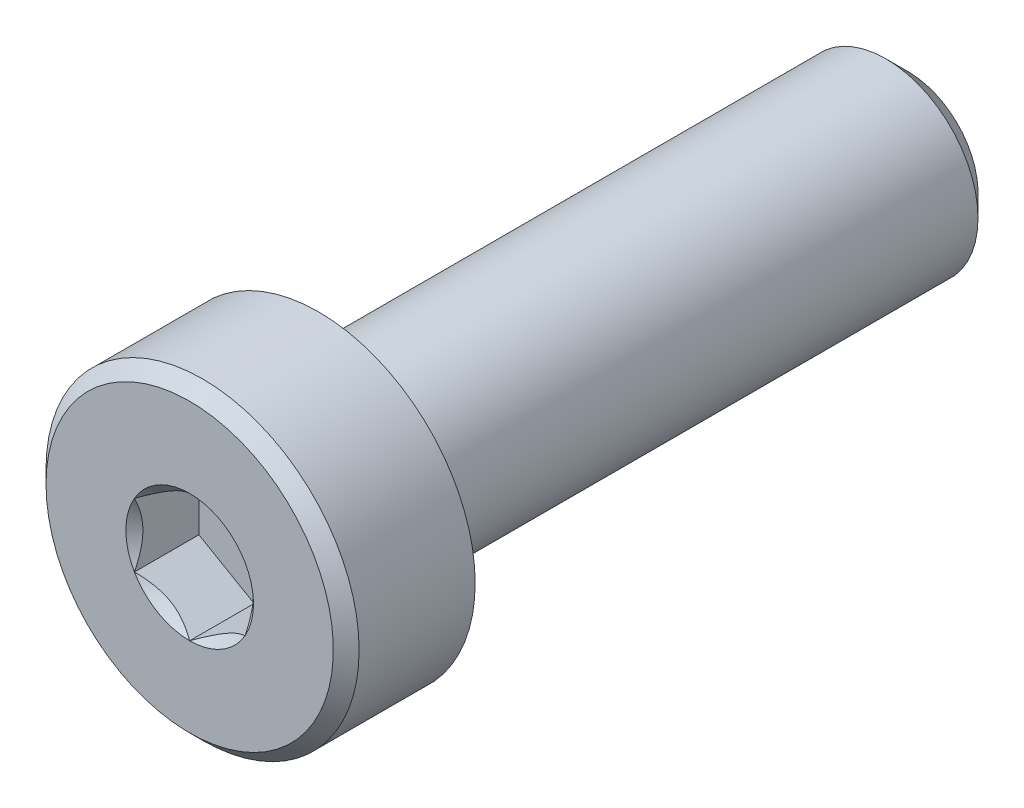
ISO-10303-21;
HEADER;
FILE_DESCRIPTION(('STEP AP214'),'2;1');
FILE_NAME('part.step','',(''),(''),'','','');
FILE_SCHEMA(('AUTOMOTIVE_DESIGN { 1 0 10303 214 1 1 1 1 }'));
ENDSEC;
DATA;
#1=APPLICATION_CONTEXT('core data for automotive mechanical design processes');
#2=APPLICATION_PROTOCOL_DEFINITION('international standard','automotive_design',2000,#1);
#3=PRODUCT_CONTEXT('',#1,'mechanical');
#4=PRODUCT('Part','Part','',(#3));
#5=PRODUCT_RELATED_PRODUCT_CATEGORY('part','',(#4));
#6=PRODUCT_DEFINITION_FORMATION('','',#4);
#7=PRODUCT_DEFINITION_CONTEXT('part definition',#1,'design');
#8=PRODUCT_DEFINITION('design','',#6,#7);
#9=PRODUCT_DEFINITION_SHAPE('','',#8);
#10=(LENGTH_UNIT() NAMED_UNIT(*) SI_UNIT(.MILLI.,.METRE.));
#11=(NAMED_UNIT(*) PLANE_ANGLE_UNIT() SI_UNIT($,.RADIAN.));
#12=(NAMED_UNIT(*) SI_UNIT($,.STERADIAN.) SOLID_ANGLE_UNIT());
#13=UNCERTAINTY_MEASURE_WITH_UNIT(LENGTH_MEASURE(1.E-05),#10,'distance_accuracy_value','');
#14=(GEOMETRIC_REPRESENTATION_CONTEXT(3) GLOBAL_UNCERTAINTY_ASSIGNED_CONTEXT((#13)) GLOBAL_UNIT_ASSIGNED_CONTEXT((#10,
#11,#12)) REPRESENTATION_CONTEXT('',''));
#15=CARTESIAN_POINT('',(0.,0.,0.));
#16=DIRECTION('',(0.,0.,1.));
#17=DIRECTION('',(1.,0.,0.));
#18=AXIS2_PLACEMENT_3D('',#15,#16,#17);
#19=CARTESIAN_POINT('',(0.,0.,9.75));
#20=DIRECTION('',(0.,0.,1.));
#21=DIRECTION('',(1.,0.,0.));
#22=AXIS2_PLACEMENT_3D('',#19,#20,#21);
#23=PLANE('',#22);
#24=CARTESIAN_POINT('',(0.,0.,9.75));
#25=DIRECTION('',(0.,0.,1.));
#26=DIRECTION('',(1.,0.,0.));
#27=AXIS2_PLACEMENT_3D('',#24,#25,#26);
#28=CIRCLE('',#27,1.73205080756888);
#29=CARTESIAN_POINT('',(1.5,0.866025403784443,9.75));
#30=VERTEX_POINT('',#29);
#31=CARTESIAN_POINT('',(0.,1.73205080756888,9.75));
#32=VERTEX_POINT('',#31);
#33=EDGE_CURVE('E177',#30,#32,#28,.T.);
#34=ORIENTED_EDGE('',*,*,#33,.F.);
#35=CARTESIAN_POINT('',(1.5,-0.866025403784439,9.75));
#36=VERTEX_POINT('',#35);
#37=EDGE_CURVE('E185',#36,#30,#28,.T.);
#38=ORIENTED_EDGE('',*,*,#37,.F.);
#39=CARTESIAN_POINT('',(0.,-1.73205080756888,9.75));
#40=VERTEX_POINT('',#39);
#41=EDGE_CURVE('E191',#40,#36,#28,.T.);
#42=ORIENTED_EDGE('',*,*,#41,.F.);
#43=CARTESIAN_POINT('',(-1.5,-0.866025403784441,9.75));
#44=VERTEX_POINT('',#43);
#45=EDGE_CURVE('E53',#44,#40,#28,.T.);
#46=ORIENTED_EDGE('',*,*,#45,.F.);
#47=CARTESIAN_POINT('',(-1.5,0.86602540378444,9.75));
#48=VERTEX_POINT('',#47);
#49=EDGE_CURVE('E61',#48,#44,#28,.T.);
#50=ORIENTED_EDGE('',*,*,#49,.F.);
#51=EDGE_CURVE('E182',#32,#48,#28,.T.);
#52=ORIENTED_EDGE('',*,*,#51,.F.);
#53=EDGE_LOOP('',(#34,#38,#42,#46,#50,#52));
#54=FACE_BOUND('',#53,.T.);
#55=CARTESIAN_POINT('',(0.,0.,9.75));
#56=DIRECTION('',(0.,0.,-1.));
#57=DIRECTION('',(-1.,0.,0.));
#58=AXIS2_PLACEMENT_3D('',#55,#56,#57);
#59=CIRCLE('',#58,3.9);
#60=CARTESIAN_POINT('',(-3.9,0.,9.75));
#61=VERTEX_POINT('',#60);
#62=EDGE_CURVE('E48',#61,#61,#59,.T.);
#63=ORIENTED_EDGE('',*,*,#62,.F.);
#64=EDGE_LOOP('',(#63));
#65=FACE_BOUND('',#64,.T.);
#66=ADVANCED_FACE('F34',(#54,#65),#23,.T.);
#67=CARTESIAN_POINT('',(0.,0.,9.4));
#68=DIRECTION('',(0.,0.,-1.));
#69=DIRECTION('',(-1.,0.,0.));
#70=AXIS2_PLACEMENT_3D('',#67,#68,#69);
#71=CONICAL_SURFACE('',#70,4.25,0.785398163397451);
#72=ORIENTED_EDGE('',*,*,#62,.T.);
#73=EDGE_LOOP('',(#72));
#74=FACE_BOUND('',#73,.T.);
#75=CARTESIAN_POINT('',(0.,0.,9.4));
#76=DIRECTION('',(0.,0.,-1.));
#77=DIRECTION('',(-1.,0.,0.));
#78=AXIS2_PLACEMENT_3D('',#75,#76,#77);
#79=CIRCLE('',#78,4.25);
#80=CARTESIAN_POINT('',(-4.25,0.,9.4));
#81=VERTEX_POINT('',#80);
#82=EDGE_CURVE('E160',#81,#81,#79,.T.);
#83=ORIENTED_EDGE('',*,*,#82,.F.);
#84=EDGE_LOOP('',(#83));
#85=FACE_BOUND('',#84,.T.);
#86=ADVANCED_FACE('F164',(#74,#85),#71,.T.);
#87=CARTESIAN_POINT('',(0.,0.,-9.75));
#88=DIRECTION('',(0.,0.,-1.));
#89=DIRECTION('',(-1.,0.,0.));
#90=AXIS2_PLACEMENT_3D('',#87,#88,#89);
#91=CYLINDRICAL_SURFACE('',#90,4.25);
#92=ORIENTED_EDGE('',*,*,#82,.T.);
#93=EDGE_LOOP('',(#92));
#94=FACE_BOUND('',#93,.T.);
#95=CARTESIAN_POINT('',(0.,0.,6.25));
#96=DIRECTION('',(0.,0.,-1.));
#97=DIRECTION('',(-1.,0.,0.));
#98=AXIS2_PLACEMENT_3D('',#95,#96,#97);
#99=CIRCLE('',#98,4.25);
#100=CARTESIAN_POINT('',(-4.25,0.,6.25));
#101=VERTEX_POINT('',#100);
#102=EDGE_CURVE('E157',#101,#101,#99,.T.);
#103=ORIENTED_EDGE('',*,*,#102,.F.);
#104=EDGE_LOOP('',(#103));
#105=FACE_BOUND('',#104,.T.);
#106=ADVANCED_FACE('F174',(#94,#105),#91,.T.);
#107=CARTESIAN_POINT('',(0.,4.25,6.25));
#108=DIRECTION('',(0.,0.,-1.));
#109=DIRECTION('',(-1.,0.,0.));
#110=AXIS2_PLACEMENT_3D('',#107,#108,#109);
#111=PLANE('',#110);
#112=ORIENTED_EDGE('',*,*,#102,.T.);
#113=EDGE_LOOP('',(#112));
#114=FACE_BOUND('',#113,.T.);
#115=CARTESIAN_POINT('',(0.,0.,6.25));
#116=DIRECTION('',(0.,0.,-1.));
#117=DIRECTION('',(-1.,0.,0.));
#118=AXIS2_PLACEMENT_3D('',#115,#116,#117);
#119=CIRCLE('',#118,2.5);
#120=CARTESIAN_POINT('',(-2.5,0.,6.25));
#121=VERTEX_POINT('',#120);
#122=EDGE_CURVE('E151',#121,#121,#119,.T.);
#123=ORIENTED_EDGE('',*,*,#122,.F.);
#124=EDGE_LOOP('',(#123));
#125=FACE_BOUND('',#124,.T.);
#126=ADVANCED_FACE('F264',(#114,#125),#111,.T.);
#127=CARTESIAN_POINT('',(0.,0.,-9.75));
#128=DIRECTION('',(0.,0.,-1.));
#129=DIRECTION('',(-1.,0.,0.));
#130=AXIS2_PLACEMENT_3D('',#127,#128,#129);
#131=CYLINDRICAL_SURFACE('',#130,2.5);
#132=ORIENTED_EDGE('',*,*,#122,.T.);
#133=EDGE_LOOP('',(#132));
#134=FACE_BOUND('',#133,.T.);
#135=CARTESIAN_POINT('',(0.,0.,-9.15));
#136=DIRECTION('',(0.,0.,-1.));
#137=DIRECTION('',(-1.,0.,0.));
#138=AXIS2_PLACEMENT_3D('',#135,#136,#137);
#139=CIRCLE('',#138,2.5);
#140=CARTESIAN_POINT('',(-2.5,0.,-9.15));
#141=VERTEX_POINT('',#140);
#142=EDGE_CURVE('E152',#141,#141,#139,.T.);
#143=ORIENTED_EDGE('',*,*,#142,.F.);
#144=EDGE_LOOP('',(#143));
#145=FACE_BOUND('',#144,.T.);
#146=ADVANCED_FACE('F260',(#134,#145),#131,.T.);
#147=CARTESIAN_POINT('',(0.,0.,-9.75));
#148=DIRECTION('',(0.,0.,1.));
#149=DIRECTION('',(1.,0.,0.));
#150=AXIS2_PLACEMENT_3D('',#147,#148,#149);
#151=CONICAL_SURFACE('',#150,1.9,0.785398163397446);
#152=ORIENTED_EDGE('',*,*,#142,.T.);
#153=EDGE_LOOP('',(#152));
#154=FACE_BOUND('',#153,.T.);
#155=CARTESIAN_POINT('',(0.,0.,-9.75));
#156=DIRECTION('',(0.,0.,-1.));
#157=DIRECTION('',(-1.,0.,0.));
#158=AXIS2_PLACEMENT_3D('',#155,#156,#157);
#159=CIRCLE('',#158,1.9);
#160=CARTESIAN_POINT('',(-1.9,0.,-9.75));
#161=VERTEX_POINT('',#160);
#162=EDGE_CURVE('E140',#161,#161,#159,.T.);
#163=ORIENTED_EDGE('',*,*,#162,.F.);
#164=EDGE_LOOP('',(#163));
#165=FACE_BOUND('',#164,.T.);
#166=ADVANCED_FACE('F254',(#154,#165),#151,.T.);
#167=CARTESIAN_POINT('',(0.,1.90000000000001,-9.75));
#168=DIRECTION('',(0.,0.,-1.));
#169=DIRECTION('',(-1.,0.,0.));
#170=AXIS2_PLACEMENT_3D('',#167,#168,#169);
#171=PLANE('',#170);
#172=ORIENTED_EDGE('',*,*,#162,.T.);
#173=EDGE_LOOP('',(#172));
#174=FACE_BOUND('',#173,.T.);
#175=ADVANCED_FACE('F249',(#174),#171,.T.);
#176=CARTESIAN_POINT('',(0.,0.,9.75));
#177=DIRECTION('',(0.,0.,1.));
#178=DIRECTION('',(1.,0.,0.));
#179=AXIS2_PLACEMENT_3D('',#176,#177,#178);
#180=CONICAL_SURFACE('',#179,1.73205080756888,0.78539816339745);
#181=ORIENTED_EDGE('',*,*,#37,.T.);
#182=CARTESIAN_POINT('',(1.5,-1.72720812994823,10.3055785164605));
#183=CARTESIAN_POINT('',(1.5,-1.68515175723693,10.2738299080399));
#184=CARTESIAN_POINT('',(1.5,-1.64286104772391,10.2423925939825));
#185=CARTESIAN_POINT('',(1.5,-1.55771581058238,10.180269087717));
#186=CARTESIAN_POINT('',(1.5,-1.5148611440825,10.1495830860455));
#187=CARTESIAN_POINT('',(1.5,-1.38468134170665,10.0584071925586));
#188=CARTESIAN_POINT('',(1.5,-1.29637976089562,9.99928834354366));
#189=CARTESIAN_POINT('',(1.5,-1.11121478745132,9.88323099640349));
#190=CARTESIAN_POINT('',(1.5,-1.01415038251068,9.82660955880473));
#191=CARTESIAN_POINT('',(1.5,-0.815173408989816,9.72303688130909));
#192=CARTESIAN_POINT('',(1.5,-0.713278669326361,9.67605304157207));
#193=CARTESIAN_POINT('',(1.5,-0.560333775001792,9.61857266845154));
#194=CARTESIAN_POINT('',(1.5,-0.511547983012751,9.60207538777834));
#195=CARTESIAN_POINT('',(1.5,-0.412798620213831,9.57299751294763));
#196=CARTESIAN_POINT('',(1.5,-0.362834968520753,9.5604171886138));
#197=CARTESIAN_POINT('',(1.5,-0.262863235540419,9.54003619416346));
#198=CARTESIAN_POINT('',(1.5,-0.212872113909477,9.53215363276045));
#199=CARTESIAN_POINT('',(1.5,-0.112355243682834,9.52132206397768));
#200=CARTESIAN_POINT('',(1.5,-0.0618295884917333,9.51837220852945));
#201=CARTESIAN_POINT('',(1.5,0.037429173202547,9.51762485772178));
#202=CARTESIAN_POINT('',(1.5,0.0861609670655318,9.51964473355048));
#203=CARTESIAN_POINT('',(1.5,0.183206937624693,9.52832255287941));
#204=CARTESIAN_POINT('',(1.5,0.231521073289698,9.53498094694588));
#205=CARTESIAN_POINT('',(1.5,0.328199853268105,9.55268524408904));
#206=CARTESIAN_POINT('',(1.5,0.376550616148689,9.56380581121775));
#207=CARTESIAN_POINT('',(1.5,0.472195696955758,9.58984341399777));
#208=CARTESIAN_POINT('',(1.5,0.519490102919007,9.6047601319841));
#209=CARTESIAN_POINT('',(1.5,0.668391282485061,9.65733522351148));
#210=CARTESIAN_POINT('',(1.5,0.767878709264948,9.70098128736183));
#211=CARTESIAN_POINT('',(1.5,0.962179866385497,9.79802299442906));
#212=CARTESIAN_POINT('',(1.5,1.05697519927965,9.85145366489712));
#213=CARTESIAN_POINT('',(1.5,1.23814273494588,9.96168585175783));
#214=CARTESIAN_POINT('',(1.5,1.32469942140117,10.0181879204262));
#215=CARTESIAN_POINT('',(1.5,1.45222331245984,10.1055343012678));
#216=CARTESIAN_POINT('',(1.5,1.49418091932911,10.1349577583565));
#217=CARTESIAN_POINT('',(1.5,1.57752272883329,10.1945828214816));
#218=CARTESIAN_POINT('',(1.5,1.61890708598059,10.2247842113029));
#219=CARTESIAN_POINT('',(1.5,1.66005277969054,10.2553081782352));
#220=B_SPLINE_CURVE_WITH_KNOTS('',3,(#182,#183,#184,#185,#186,#187,#188,#189,#190,#191,#192,
#193,#194,#195,#196,#197,#198,#199,#200,#201,#202,#203,#204,#205,#206,#207,#208,#209,#210,#211,
#212,#213,#214,#215,#216,#217,#218,#219),.UNSPECIFIED.,.F.,.F.,(4,2,2,2,2,2,2,2,2,2,2,2,2,2,2,2,
2,2,4),(0.,0.158079549012757,0.316198781054128,0.634850417468465,0.971690311551783,
1.30737131686505,1.46173961151184,1.61611853763032,1.76772101442095,1.91929742387554,
2.06538741227089,2.21149159321503,2.36014984648185,2.50879566399376,2.83376031423511,
3.15991186974582,3.4698560178094,3.62358896013691,3.77727962610764),.UNSPECIFIED.);
#221=EDGE_CURVE('E11',#36,#30,#220,.T.);
#222=ORIENTED_EDGE('',*,*,#221,.F.);
#223=EDGE_LOOP('',(#181,#222));
#224=FACE_BOUND('',#223,.T.);
#225=ADVANCED_FACE('F219',(#224),#180,.F.);
#226=ORIENTED_EDGE('',*,*,#33,.T.);
#227=CARTESIAN_POINT('',(1.5002,0.865909933730603,9.75011548160007));
#228=CARTESIAN_POINT('',(1.44863220926292,0.895682611594168,9.72036547606733));
#229=CARTESIAN_POINT('',(1.3962020823348,0.925953159489767,9.69236248391031));
#230=CARTESIAN_POINT('',(1.2892909659444,0.987678321317125,9.64108923044014));
#231=CARTESIAN_POINT('',(1.23479980418534,1.01913880822718,9.61784750504437));
#232=CARTESIAN_POINT('',(1.12492091864275,1.08257741237345,9.57803372899222));
#233=CARTESIAN_POINT('',(1.0695611909048,1.11453936608522,9.5613615856709));
#234=CARTESIAN_POINT('',(0.957622742522849,1.1791670593912,9.53567445681811));
#235=CARTESIAN_POINT('',(0.901047443446991,1.21183082354213,9.52664029047887));
#236=CARTESIAN_POINT('',(0.803544610483559,1.26812411040032,9.51848908122686));
#237=CARTESIAN_POINT('',(0.762743091719534,1.29168087824208,9.51728225298922));
#238=CARTESIAN_POINT('',(0.681212030384142,1.33875285845138,9.51931405716227));
#239=CARTESIAN_POINT('',(0.64048250568537,1.36226806050018,9.52255367074831));
#240=CARTESIAN_POINT('',(0.559415597836584,1.40907206156905,9.53329198598196));
#241=CARTESIAN_POINT('',(0.519078615401712,1.43236062923612,9.54079465301873));
#242=CARTESIAN_POINT('',(0.439081663085969,1.47854689118997,9.55965161192829));
#243=CARTESIAN_POINT('',(0.399421991483792,1.50144441326545,9.57100755701859));
#244=CARTESIAN_POINT('',(0.297836865225515,1.56009461325633,9.60472164759267));
#245=CARTESIAN_POINT('',(0.236541446290311,1.59548353987866,9.62962184909337));
#246=CARTESIAN_POINT('',(0.146414371536687,1.64751843074894,9.67165665327158));
#247=CARTESIAN_POINT('',(0.116714860092283,1.66466545167617,9.6864251535591));
#248=CARTESIAN_POINT('',(0.0578620986162501,1.69864410935691,9.71731056594017));
#249=CARTESIAN_POINT('',(0.0287085957793641,1.71547589206761,9.73342683412171));
#250=CARTESIAN_POINT('',(-0.000199999999998554,1.73216627762271,9.75011548160007));
#251=B_SPLINE_CURVE_WITH_KNOTS('',3,(#227,#228,#229,#230,#231,#232,#233,#234,#235,#236,#237,
#238,#239,#240,#241,#242,#243,#244,#245,#246,#247,#248,#249,#250),.UNSPECIFIED.,.F.,.F.,(4,2,2,
2,2,2,2,2,2,2,2,4),(0.,0.199829143693304,0.400822987382388,0.598623720538179,0.795926240188886,
0.937113067959878,1.07833105577192,1.21968061668222,1.36109089931054,1.58570969637565,
1.69770705470963,1.80965120737193),.UNSPECIFIED.);
#252=EDGE_CURVE('E187',#30,#32,#251,.T.);
#253=ORIENTED_EDGE('',*,*,#252,.F.);
#254=EDGE_LOOP('',(#226,#253));
#255=FACE_BOUND('',#254,.T.);
#256=ADVANCED_FACE('F315',(#255),#180,.F.);
#257=ORIENTED_EDGE('',*,*,#51,.T.);
#258=CARTESIAN_POINT('',(0.000200000000001173,1.73216627762272,9.75011548160008));
#259=CARTESIAN_POINT('',(-0.0513677907370745,1.70239359975915,9.72036547606733));
#260=CARTESIAN_POINT('',(-0.103797917665199,1.67212305186355,9.69236248391032));
#261=CARTESIAN_POINT('',(-0.210709034055595,1.61039789003619,9.64108923044014));
#262=CARTESIAN_POINT('',(-0.265200195814659,1.57893740312614,9.61784750504438));
#263=CARTESIAN_POINT('',(-0.375079081357247,1.51549879897987,9.57803372899222));
#264=CARTESIAN_POINT('',(-0.430438809095198,1.4835368452681,9.5613615856709));
#265=CARTESIAN_POINT('',(-0.542377257477149,1.41890915196211,9.53567445681811));
#266=CARTESIAN_POINT('',(-0.598952556553007,1.38624538781118,9.52664029047887));
#267=CARTESIAN_POINT('',(-0.696455389516439,1.329952100953,9.51848908122686));
#268=CARTESIAN_POINT('',(-0.737256908280465,1.30639533311124,9.51728225298922));
#269=CARTESIAN_POINT('',(-0.818787969615857,1.25932335290194,9.51931405716227));
#270=CARTESIAN_POINT('',(-0.859517494314628,1.23580815085313,9.52255367074831));
#271=CARTESIAN_POINT('',(-0.940584402163415,1.18900414978427,9.53329198598196));
#272=CARTESIAN_POINT('',(-0.980921384598287,1.1657155821172,9.54079465301874));
#273=CARTESIAN_POINT('',(-1.06091833691403,1.11952932016335,9.55965161192829));
#274=CARTESIAN_POINT('',(-1.10057800851621,1.09663179808786,9.57100755701859));
#275=CARTESIAN_POINT('',(-1.20216313477448,1.03798159809699,9.60472164759267));
#276=CARTESIAN_POINT('',(-1.26345855370969,1.00259267147465,9.62962184909337));
#277=CARTESIAN_POINT('',(-1.35358562846331,0.950557780604376,9.67165665327158));
#278=CARTESIAN_POINT('',(-1.38328513990772,0.933410759677149,9.6864251535591));
#279=CARTESIAN_POINT('',(-1.44213790138375,0.899432101996408,9.71731056594017));
#280=CARTESIAN_POINT('',(-1.47129140422064,0.882600319285711,9.73342683412171));
#281=CARTESIAN_POINT('',(-1.5002,0.865909933730602,9.75011548160008));
#282=B_SPLINE_CURVE_WITH_KNOTS('',3,(#258,#259,#260,#261,#262,#263,#264,#265,#266,#267,#268,
#269,#270,#271,#272,#273,#274,#275,#276,#277,#278,#279,#280,#281),.UNSPECIFIED.,.F.,.F.,(4,2,2,
2,2,2,2,2,2,2,2,4),(0.,0.199829143693304,0.400822987382388,0.598623720538181,0.795926240188889,
0.937113067959881,1.07833105577193,1.21968061668222,1.36109089931054,1.58570969637565,
1.69770705470964,1.80965120737194),.UNSPECIFIED.);
#283=EDGE_CURVE('E186',#32,#48,#282,.T.);
#284=ORIENTED_EDGE('',*,*,#283,.F.);
#285=EDGE_LOOP('',(#257,#284));
#286=FACE_BOUND('',#285,.T.);
#287=ADVANCED_FACE('F319',(#286),#180,.F.);
#288=ORIENTED_EDGE('',*,*,#49,.T.);
#289=CARTESIAN_POINT('',(-1.5,-1.72720812969692,10.3055785162708));
#290=CARTESIAN_POINT('',(-1.5,-1.68515175699268,10.2738299078574));
#291=CARTESIAN_POINT('',(-1.5,-1.64286104748673,10.2423925938074));
#292=CARTESIAN_POINT('',(-1.5,-1.55771581035942,10.1802690875564));
#293=CARTESIAN_POINT('',(-1.5,-1.51486114386668,10.1495830858922));
#294=CARTESIAN_POINT('',(-1.5,-1.3846813415127,10.0584071924272));
#295=CARTESIAN_POINT('',(-1.5,-1.29637976071653,9.99928834342677));
#296=CARTESIAN_POINT('',(-1.5,-1.11121478730467,9.8832309963165));
#297=CARTESIAN_POINT('',(-1.5,-1.01415038238167,9.82660955873301));
#298=CARTESIAN_POINT('',(-1.5,-0.815173408897604,9.72303688126565));
#299=CARTESIAN_POINT('',(-1.5,-0.713278669253284,9.67605304154167));
#300=CARTESIAN_POINT('',(-1.5,-0.560333774943111,9.61857266843083));
#301=CARTESIAN_POINT('',(-1.5,-0.511547982948041,9.60207538775725));
#302=CARTESIAN_POINT('',(-1.5,-0.412798620136866,9.572997512927));
#303=CARTESIAN_POINT('',(-1.5,-0.362834968437562,9.56041718859402));
#304=CARTESIAN_POINT('',(-1.5,-0.262863235444981,9.54003619414677));
#305=CARTESIAN_POINT('',(-1.5,-0.212872113808022,9.53215363274598));
#306=CARTESIAN_POINT('',(-1.5,-0.112355243569544,9.521322063969));
#307=CARTESIAN_POINT('',(-1.5,-0.0618295883726267,9.51837220852435));
#308=CARTESIAN_POINT('',(-1.5,0.0374291733323851,9.51762485772485));
#309=CARTESIAN_POINT('',(-1.5,0.0861609672002997,9.51964473355808));
#310=CARTESIAN_POINT('',(-1.5,0.183206937768827,9.52832255289676));
#311=CARTESIAN_POINT('',(-1.5,0.23152107343827,9.53498094696846));
#312=CARTESIAN_POINT('',(-1.5,0.328199853425436,9.55268524412257));
#313=CARTESIAN_POINT('',(-1.5,0.376550616310329,9.56380581125704));
#314=CARTESIAN_POINT('',(-1.5,0.472195697125599,9.58984341404871));
#315=CARTESIAN_POINT('',(-1.5,0.51949010309274,9.60476013204094));
#316=CARTESIAN_POINT('',(-1.5,0.668391282696625,9.65733522359607));
#317=CARTESIAN_POINT('',(-1.5,0.767878709508553,9.70098128747198));
#318=CARTESIAN_POINT('',(-1.5,0.962179866690724,9.7980229945931));
#319=CARTESIAN_POINT('',(-1.5,1.05697519961444,9.85145366508953));
#320=CARTESIAN_POINT('',(-1.5,1.23814273533383,9.96168585200456));
#321=CARTESIAN_POINT('',(-1.5,1.3246994218129,10.0181879206986));
#322=CARTESIAN_POINT('',(-1.5,1.45222331290673,10.1055343015787));
#323=CARTESIAN_POINT('',(-1.5,1.49418091978756,10.13495775868));
#324=CARTESIAN_POINT('',(-1.5,1.57752272931476,10.1945828218305));
#325=CARTESIAN_POINT('',(-1.5,1.61890708647354,10.2247842116644));
#326=CARTESIAN_POINT('',(-1.5,1.66005278019494,10.2553081786095));
#327=B_SPLINE_CURVE_WITH_KNOTS('',3,(#289,#290,#291,#292,#293,#294,#295,#296,#297,#298,#299,
#300,#301,#302,#303,#304,#305,#306,#307,#308,#309,#310,#311,#312,#313,#314,#315,#316,#317,#318,
#319,#320,#321,#322,#323,#324,#325,#326),.UNSPECIFIED.,.F.,.F.,(4,2,2,2,2,2,2,2,2,2,2,2,2,2,2,2,
2,2,4),(0.,0.158079548982669,0.316198780993942,0.634850417346959,0.971690311361511,
1.30737131660667,1.46173961127089,1.61611853740677,1.7677210142141,1.91929742368538,
2.065387412096,2.21149159305544,2.36014984633872,2.50879566386709,2.83376031422673,
3.15991186985652,3.46985601802197,3.62358896039974,3.7772796264207),.UNSPECIFIED.);
#328=EDGE_CURVE('E197',#48,#44,#327,.F.);
#329=ORIENTED_EDGE('',*,*,#328,.F.);
#330=EDGE_LOOP('',(#288,#329));
#331=FACE_BOUND('',#330,.T.);
#332=ADVANCED_FACE('F323',(#331),#180,.F.);
#333=ORIENTED_EDGE('',*,*,#45,.T.);
#334=CARTESIAN_POINT('',(-1.5002,-0.865909933730601,9.75011548160007));
#335=CARTESIAN_POINT('',(-1.44863220926292,-0.895682611594166,9.72036547606733));
#336=CARTESIAN_POINT('',(-1.3962020823348,-0.925953159489765,9.69236248391031));
#337=CARTESIAN_POINT('',(-1.2892909659444,-0.987678321317123,9.64108923044014));
#338=CARTESIAN_POINT('',(-1.23479980418534,-1.01913880822717,9.61784750504438));
#339=CARTESIAN_POINT('',(-1.12492091864275,-1.08257741237344,9.57803372899222));
#340=CARTESIAN_POINT('',(-1.0695611909048,-1.11453936608521,9.5613615856709));
#341=CARTESIAN_POINT('',(-0.957622742522849,-1.1791670593912,9.5356744568181));
#342=CARTESIAN_POINT('',(-0.901047443446991,-1.21183082354213,9.52664029047887));
#343=CARTESIAN_POINT('',(-0.803544610483559,-1.26812411040032,9.51848908122685));
#344=CARTESIAN_POINT('',(-0.762743091719534,-1.29168087824208,9.51728225298922));
#345=CARTESIAN_POINT('',(-0.681212030384142,-1.33875285845138,9.51931405716227));
#346=CARTESIAN_POINT('',(-0.64048250568537,-1.36226806050018,9.52255367074831));
#347=CARTESIAN_POINT('',(-0.559415597836584,-1.40907206156905,9.53329198598196));
#348=CARTESIAN_POINT('',(-0.519078615401712,-1.43236062923612,9.54079465301873));
#349=CARTESIAN_POINT('',(-0.439081663085969,-1.47854689118996,9.55965161192829));
#350=CARTESIAN_POINT('',(-0.399421991483792,-1.50144441326545,9.57100755701859));
#351=CARTESIAN_POINT('',(-0.297836865225515,-1.56009461325633,9.60472164759267));
#352=CARTESIAN_POINT('',(-0.236541446290311,-1.59548353987866,9.62962184909337));
#353=CARTESIAN_POINT('',(-0.146414371536686,-1.64751843074894,9.67165665327158));
#354=CARTESIAN_POINT('',(-0.116714860092282,-1.66466545167617,9.6864251535591));
#355=CARTESIAN_POINT('',(-0.0578620986162489,-1.69864410935691,9.71731056594017));
#356=CARTESIAN_POINT('',(-0.0287085957793629,-1.71547589206761,9.73342683412171));
#357=CARTESIAN_POINT('',(0.000199999999999649,-1.73216627762271,9.75011548160007));
#358=B_SPLINE_CURVE_WITH_KNOTS('',3,(#334,#335,#336,#337,#338,#339,#340,#341,#342,#343,#344,
#345,#346,#347,#348,#349,#350,#351,#352,#353,#354,#355,#356,#357),.UNSPECIFIED.,.F.,.F.,(4,2,2,
2,2,2,2,2,2,2,2,4),(0.,0.199829143693304,0.400822987382388,0.59862372053818,0.795926240188888,
0.93711306795988,1.07833105577193,1.21968061668222,1.36109089931054,1.58570969637565,
1.69770705470963,1.80965120737193),.UNSPECIFIED.);
#359=EDGE_CURVE('E119',#44,#40,#358,.T.);
#360=ORIENTED_EDGE('',*,*,#359,.F.);
#361=EDGE_LOOP('',(#333,#360));
#362=FACE_BOUND('',#361,.T.);
#363=ADVANCED_FACE('F220',(#362),#180,.F.);
#364=ORIENTED_EDGE('',*,*,#41,.T.);
#365=CARTESIAN_POINT('',(-0.000199999999999716,-1.73216627762271,9.75011548160007));
#366=CARTESIAN_POINT('',(0.0513677907370757,-1.70239359975915,9.72036547606733));
#367=CARTESIAN_POINT('',(0.103797917665201,-1.67212305186355,9.69236248391031));
#368=CARTESIAN_POINT('',(0.210709034055597,-1.61039789003619,9.64108923044014));
#369=CARTESIAN_POINT('',(0.265200195814661,-1.57893740312614,9.61784750504438));
#370=CARTESIAN_POINT('',(0.375079081357249,-1.51549879897987,9.57803372899222));
#371=CARTESIAN_POINT('',(0.4304388090952,-1.4835368452681,9.5613615856709));
#372=CARTESIAN_POINT('',(0.542377257477151,-1.41890915196211,9.53567445681811));
#373=CARTESIAN_POINT('',(0.598952556553009,-1.38624538781118,9.52664029047887));
#374=CARTESIAN_POINT('',(0.696455389516442,-1.32995210095299,9.51848908122686));
#375=CARTESIAN_POINT('',(0.737256908280467,-1.30639533311124,9.51728225298922));
#376=CARTESIAN_POINT('',(0.818787969615859,-1.25932335290193,9.51931405716227));
#377=CARTESIAN_POINT('',(0.859517494314631,-1.23580815085313,9.52255367074831));
#378=CARTESIAN_POINT('',(0.940584402163417,-1.18900414978427,9.53329198598196));
#379=CARTESIAN_POINT('',(0.980921384598289,-1.16571558211719,9.54079465301874));
#380=CARTESIAN_POINT('',(1.06091833691403,-1.11952932016335,9.55965161192829));
#381=CARTESIAN_POINT('',(1.10057800851621,-1.09663179808786,9.57100755701859));
#382=CARTESIAN_POINT('',(1.20216313477449,-1.03798159809698,9.60472164759267));
#383=CARTESIAN_POINT('',(1.26345855370969,-1.00259267147465,9.62962184909337));
#384=CARTESIAN_POINT('',(1.35358562846331,-0.950557780604374,9.67165665327158));
#385=CARTESIAN_POINT('',(1.38328513990772,-0.933410759677147,9.6864251535591));
#386=CARTESIAN_POINT('',(1.44213790138375,-0.899432101996407,9.71731056594017));
#387=CARTESIAN_POINT('',(1.47129140422064,-0.88260031928571,9.73342683412171));
#388=CARTESIAN_POINT('',(1.5002,-0.865909933730601,9.75011548160007));
#389=B_SPLINE_CURVE_WITH_KNOTS('',3,(#365,#366,#367,#368,#369,#370,#371,#372,#373,#374,#375,
#376,#377,#378,#379,#380,#381,#382,#383,#384,#385,#386,#387,#388),.UNSPECIFIED.,.F.,.F.,(4,2,2,
2,2,2,2,2,2,2,2,4),(0.,0.199829143693304,0.400822987382388,0.598623720538181,0.79592624018889,
0.937113067959881,1.07833105577193,1.21968061668222,1.36109089931054,1.58570969637565,
1.69770705470963,1.80965120737193),.UNSPECIFIED.);
#390=EDGE_CURVE('E103',#40,#36,#389,.T.);
#391=ORIENTED_EDGE('',*,*,#390,.F.);
#392=EDGE_LOOP('',(#364,#391));
#393=FACE_BOUND('',#392,.T.);
#394=ADVANCED_FACE('F194',(#393),#180,.F.);
#395=CARTESIAN_POINT('',(0.,0.,8.));
#396=DIRECTION('',(0.,0.,1.));
#397=DIRECTION('',(1.,0.,0.));
#398=AXIS2_PLACEMENT_3D('',#395,#396,#397);
#399=PLANE('',#398);
#400=DIRECTION('',(0.866025403784439,0.5,0.));
#401=VECTOR('',#400,1.);
#402=CARTESIAN_POINT('',(0.,-1.73205080756888,8.));
#403=LINE('',#402,#401);
#404=CARTESIAN_POINT('',(0.,-1.73205080756888,8.));
#405=VERTEX_POINT('',#404);
#406=CARTESIAN_POINT('',(1.5,-0.866025403784439,8.));
#407=VERTEX_POINT('',#406);
#408=EDGE_CURVE('E100',#405,#407,#403,.T.);
#409=ORIENTED_EDGE('',*,*,#408,.T.);
#410=DIRECTION('',(0.,1.,0.));
#411=VECTOR('',#410,1.);
#412=CARTESIAN_POINT('',(1.5,-0.866025403784439,8.));
#413=LINE('',#412,#411);
#414=CARTESIAN_POINT('',(1.5,0.866025403784441,8.));
#415=VERTEX_POINT('',#414);
#416=EDGE_CURVE('E108',#407,#415,#413,.T.);
#417=ORIENTED_EDGE('',*,*,#416,.T.);
#418=DIRECTION('',(-0.866025403784439,0.5,0.));
#419=VECTOR('',#418,1.);
#420=CARTESIAN_POINT('',(1.5,0.866025403784441,8.));
#421=LINE('',#420,#419);
#422=CARTESIAN_POINT('',(0.,1.73205080756888,8.));
#423=VERTEX_POINT('',#422);
#424=EDGE_CURVE('E112',#415,#423,#421,.T.);
#425=ORIENTED_EDGE('',*,*,#424,.T.);
#426=DIRECTION('',(-0.866025403784439,-0.499999999999999,0.));
#427=VECTOR('',#426,1.);
#428=CARTESIAN_POINT('',(0.,1.73205080756888,8.));
#429=LINE('',#428,#427);
#430=CARTESIAN_POINT('',(-1.5,0.86602540378444,8.));
#431=VERTEX_POINT('',#430);
#432=EDGE_CURVE('E129',#423,#431,#429,.T.);
#433=ORIENTED_EDGE('',*,*,#432,.T.);
#434=DIRECTION('',(0.,-1.,0.));
#435=VECTOR('',#434,1.);
#436=CARTESIAN_POINT('',(-1.5,0.86602540378444,8.));
#437=LINE('',#436,#435);
#438=CARTESIAN_POINT('',(-1.5,-0.866025403784439,8.));
#439=VERTEX_POINT('',#438);
#440=EDGE_CURVE('E135',#431,#439,#437,.T.);
#441=ORIENTED_EDGE('',*,*,#440,.T.);
#442=DIRECTION('',(0.866025403784438,-0.5,0.));
#443=VECTOR('',#442,1.);
#444=CARTESIAN_POINT('',(-1.5,-0.866025403784439,8.));
#445=LINE('',#444,#443);
#446=EDGE_CURVE('E102',#439,#405,#445,.T.);
#447=ORIENTED_EDGE('',*,*,#446,.T.);
#448=EDGE_LOOP('',(#409,#417,#425,#433,#441,#447));
#449=FACE_BOUND('',#448,.T.);
#450=ADVANCED_FACE('F116',(#449),#399,.T.);
#451=CARTESIAN_POINT('',(1.5,-0.866025403784439,8.));
#452=DIRECTION('',(1.,0.,0.));
#453=DIRECTION('',(0.,1.,0.));
#454=AXIS2_PLACEMENT_3D('',#451,#452,#453);
#455=PLANE('',#454);
#456=DIRECTION('',(0.,0.,1.));
#457=VECTOR('',#456,1.);
#458=CARTESIAN_POINT('',(1.5,-0.866025403784439,8.));
#459=LINE('',#458,#457);
#460=EDGE_CURVE('E93',#407,#36,#459,.T.);
#461=ORIENTED_EDGE('',*,*,#460,.T.);
#462=ORIENTED_EDGE('',*,*,#221,.T.);
#463=DIRECTION('',(0.,0.,1.));
#464=VECTOR('',#463,1.);
#465=CARTESIAN_POINT('',(1.5,0.866025403784441,8.));
#466=LINE('',#465,#464);
#467=EDGE_CURVE('E104',#415,#30,#466,.T.);
#468=ORIENTED_EDGE('',*,*,#467,.F.);
#469=ORIENTED_EDGE('',*,*,#416,.F.);
#470=EDGE_LOOP('',(#461,#462,#468,#469));
#471=FACE_BOUND('',#470,.T.);
#472=ADVANCED_FACE('F107',(#471),#455,.F.);
#473=CARTESIAN_POINT('',(1.5,0.866025403784441,8.));
#474=DIRECTION('',(0.5,0.866025403784439,0.));
#475=DIRECTION('',(-0.866025403784439,0.5,0.));
#476=AXIS2_PLACEMENT_3D('',#473,#474,#475);
#477=PLANE('',#476);
#478=ORIENTED_EDGE('',*,*,#467,.T.);
#479=ORIENTED_EDGE('',*,*,#252,.T.);
#480=DIRECTION('',(0.,0.,1.));
#481=VECTOR('',#480,1.);
#482=CARTESIAN_POINT('',(0.,1.73205080756888,8.));
#483=LINE('',#482,#481);
#484=EDGE_CURVE('E143',#423,#32,#483,.T.);
#485=ORIENTED_EDGE('',*,*,#484,.F.);
#486=ORIENTED_EDGE('',*,*,#424,.F.);
#487=EDGE_LOOP('',(#478,#479,#485,#486));
#488=FACE_BOUND('',#487,.T.);
#489=ADVANCED_FACE('F237',(#488),#477,.F.);
#490=CARTESIAN_POINT('',(0.,1.73205080756888,8.));
#491=DIRECTION('',(-0.499999999999999,0.866025403784439,0.));
#492=DIRECTION('',(-0.866025403784439,-0.499999999999999,0.));
#493=AXIS2_PLACEMENT_3D('',#490,#491,#492);
#494=PLANE('',#493);
#495=ORIENTED_EDGE('',*,*,#484,.T.);
#496=ORIENTED_EDGE('',*,*,#283,.T.);
#497=DIRECTION('',(0.,0.,1.));
#498=VECTOR('',#497,1.);
#499=CARTESIAN_POINT('',(-1.5,0.86602540378444,8.));
#500=LINE('',#499,#498);
#501=EDGE_CURVE('E145',#431,#48,#500,.T.);
#502=ORIENTED_EDGE('',*,*,#501,.F.);
#503=ORIENTED_EDGE('',*,*,#432,.F.);
#504=EDGE_LOOP('',(#495,#496,#502,#503));
#505=FACE_BOUND('',#504,.T.);
#506=ADVANCED_FACE('F232',(#505),#494,.F.);
#507=CARTESIAN_POINT('',(-1.5,0.86602540378444,8.));
#508=DIRECTION('',(-1.,0.,0.));
#509=DIRECTION('',(0.,-1.,0.));
#510=AXIS2_PLACEMENT_3D('',#507,#508,#509);
#511=PLANE('',#510);
#512=ORIENTED_EDGE('',*,*,#501,.T.);
#513=ORIENTED_EDGE('',*,*,#328,.T.);
#514=DIRECTION('',(0.,0.,1.));
#515=VECTOR('',#514,1.);
#516=CARTESIAN_POINT('',(-1.5,-0.866025403784439,8.));
#517=LINE('',#516,#515);
#518=EDGE_CURVE('E136',#439,#44,#517,.T.);
#519=ORIENTED_EDGE('',*,*,#518,.F.);
#520=ORIENTED_EDGE('',*,*,#440,.F.);
#521=EDGE_LOOP('',(#512,#513,#519,#520));
#522=FACE_BOUND('',#521,.T.);
#523=ADVANCED_FACE('F238',(#522),#511,.F.);
#524=CARTESIAN_POINT('',(-1.5,-0.866025403784439,8.));
#525=DIRECTION('',(-0.5,-0.866025403784438,0.));
#526=DIRECTION('',(0.866025403784439,-0.5,0.));
#527=AXIS2_PLACEMENT_3D('',#524,#525,#526);
#528=PLANE('',#527);
#529=ORIENTED_EDGE('',*,*,#518,.T.);
#530=ORIENTED_EDGE('',*,*,#359,.T.);
#531=DIRECTION('',(0.,0.,1.));
#532=VECTOR('',#531,1.);
#533=CARTESIAN_POINT('',(0.,-1.73205080756888,8.));
#534=LINE('',#533,#532);
#535=EDGE_CURVE('E137',#405,#40,#534,.T.);
#536=ORIENTED_EDGE('',*,*,#535,.F.);
#537=ORIENTED_EDGE('',*,*,#446,.F.);
#538=EDGE_LOOP('',(#529,#530,#536,#537));
#539=FACE_BOUND('',#538,.T.);
#540=ADVANCED_FACE('F200',(#539),#528,.F.);
#541=CARTESIAN_POINT('',(0.,-1.73205080756888,8.));
#542=DIRECTION('',(0.5,-0.866025403784439,0.));
#543=DIRECTION('',(0.866025403784439,0.5,0.));
#544=AXIS2_PLACEMENT_3D('',#541,#542,#543);
#545=PLANE('',#544);
#546=ORIENTED_EDGE('',*,*,#535,.T.);
#547=ORIENTED_EDGE('',*,*,#390,.T.);
#548=ORIENTED_EDGE('',*,*,#460,.F.);
#549=ORIENTED_EDGE('',*,*,#408,.F.);
#550=EDGE_LOOP('',(#546,#547,#548,#549));
#551=FACE_BOUND('',#550,.T.);
#552=ADVANCED_FACE('F97',(#551),#545,.F.);
#553=CLOSED_SHELL('',(#66,#86,#106,#126,#146,#166,#175,#225,#256,#287,#332,#363,#394,#450,#472,
#489,#506,#523,#540,#552));
#554=MANIFOLD_SOLID_BREP('B2',#553);
#555=ADVANCED_BREP_SHAPE_REPRESENTATION('',(#18,#554),#14);
#556=SHAPE_DEFINITION_REPRESENTATION(#9,#555);
ENDSEC;
END-ISO-10303-21;
